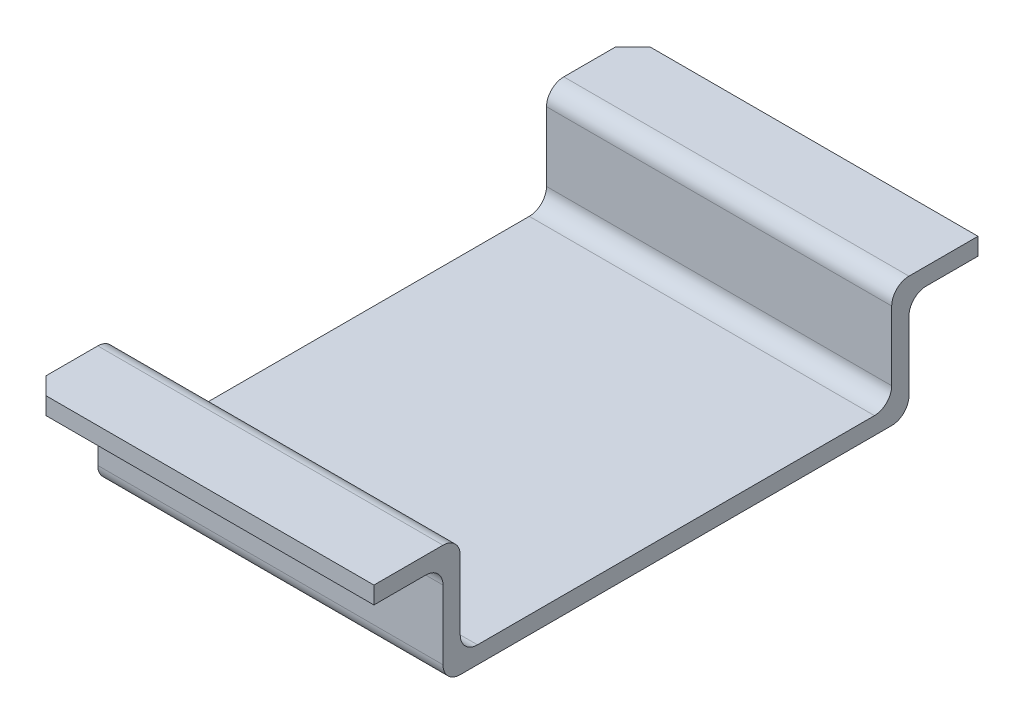
ISO-10303-21;
HEADER;
FILE_DESCRIPTION(('STEP AP214'),'2;1');
FILE_NAME('part.step','',(''),(''),'','','');
FILE_SCHEMA(('AUTOMOTIVE_DESIGN { 1 0 10303 214 1 1 1 1 }'));
ENDSEC;
DATA;
#1=APPLICATION_CONTEXT('core data for automotive mechanical design processes');
#2=APPLICATION_PROTOCOL_DEFINITION('international standard','automotive_design',2000,#1);
#3=PRODUCT_CONTEXT('',#1,'mechanical');
#4=PRODUCT('Part','Part','',(#3));
#5=PRODUCT_RELATED_PRODUCT_CATEGORY('part','',(#4));
#6=PRODUCT_DEFINITION_FORMATION('','',#4);
#7=PRODUCT_DEFINITION_CONTEXT('part definition',#1,'design');
#8=PRODUCT_DEFINITION('design','',#6,#7);
#9=PRODUCT_DEFINITION_SHAPE('','',#8);
#10=(LENGTH_UNIT() NAMED_UNIT(*) SI_UNIT(.MILLI.,.METRE.));
#11=(NAMED_UNIT(*) PLANE_ANGLE_UNIT() SI_UNIT($,.RADIAN.));
#12=(NAMED_UNIT(*) SI_UNIT($,.STERADIAN.) SOLID_ANGLE_UNIT());
#13=UNCERTAINTY_MEASURE_WITH_UNIT(LENGTH_MEASURE(1.E-05),#10,'distance_accuracy_value','');
#14=(GEOMETRIC_REPRESENTATION_CONTEXT(3) GLOBAL_UNCERTAINTY_ASSIGNED_CONTEXT((#13)) GLOBAL_UNIT_ASSIGNED_CONTEXT((#10,
#11,#12)) REPRESENTATION_CONTEXT('',''));
#15=CARTESIAN_POINT('',(0.,0.,0.));
#16=DIRECTION('',(0.,0.,1.));
#17=DIRECTION('',(1.,0.,0.));
#18=AXIS2_PLACEMENT_3D('',#15,#16,#17);
#19=CARTESIAN_POINT('',(20.,-1.,-13.5));
#20=DIRECTION('',(0.,0.,1.));
#21=DIRECTION('',(1.,0.,0.));
#22=AXIS2_PLACEMENT_3D('',#19,#20,#21);
#23=PLANE('',#22);
#24=DIRECTION('',(0.,1.,0.));
#25=VECTOR('',#24,1.);
#26=CARTESIAN_POINT('',(20.,-1.,-13.5));
#27=LINE('',#26,#25);
#28=CARTESIAN_POINT('',(20.,0.,-13.5));
#29=VERTEX_POINT('',#28);
#30=CARTESIAN_POINT('',(20.,4.,-13.5));
#31=VERTEX_POINT('',#30);
#32=EDGE_CURVE('E194',#29,#31,#27,.T.);
#33=ORIENTED_EDGE('',*,*,#32,.F.);
#34=DIRECTION('',(-1.,0.,0.));
#35=VECTOR('',#34,1.);
#36=CARTESIAN_POINT('',(20.,0.,-13.5));
#37=LINE('',#36,#35);
#38=CARTESIAN_POINT('',(0.,0.,-13.5));
#39=VERTEX_POINT('',#38);
#40=EDGE_CURVE('E308',#29,#39,#37,.T.);
#41=ORIENTED_EDGE('',*,*,#40,.T.);
#42=DIRECTION('',(0.,1.,0.));
#43=VECTOR('',#42,1.);
#44=CARTESIAN_POINT('',(0.,-1.,-13.5));
#45=LINE('',#44,#43);
#46=CARTESIAN_POINT('',(0.,4.,-13.5));
#47=VERTEX_POINT('',#46);
#48=EDGE_CURVE('E232',#39,#47,#45,.T.);
#49=ORIENTED_EDGE('',*,*,#48,.T.);
#50=DIRECTION('',(-1.,0.,0.));
#51=VECTOR('',#50,1.);
#52=CARTESIAN_POINT('',(20.,4.,-13.5));
#53=LINE('',#52,#51);
#54=EDGE_CURVE('E306',#47,#31,#53,.F.);
#55=ORIENTED_EDGE('',*,*,#54,.T.);
#56=EDGE_LOOP('',(#33,#41,#49,#55));
#57=FACE_BOUND('',#56,.T.);
#58=ADVANCED_FACE('F34',(#57),#23,.F.);
#59=CARTESIAN_POINT('',(20.,5.,-13.5));
#60=DIRECTION('',(0.,1.,0.));
#61=DIRECTION('',(0.,0.,1.));
#62=AXIS2_PLACEMENT_3D('',#59,#60,#61);
#63=PLANE('',#62);
#64=DIRECTION('',(0.,0.,-1.));
#65=VECTOR('',#64,1.);
#66=CARTESIAN_POINT('',(0.,5.,-13.5));
#67=LINE('',#66,#65);
#68=CARTESIAN_POINT('',(0.,5.,-14.5));
#69=VERTEX_POINT('',#68);
#70=CARTESIAN_POINT('',(0.,5.,-16.5));
#71=VERTEX_POINT('',#70);
#72=EDGE_CURVE('E235',#69,#71,#67,.T.);
#73=ORIENTED_EDGE('',*,*,#72,.T.);
#74=DIRECTION('',(0.707106781186546,0.,-0.707106781186549));
#75=VECTOR('',#74,1.);
#76=CARTESIAN_POINT('',(1.,5.,-17.5));
#77=LINE('',#76,#75);
#78=CARTESIAN_POINT('',(1.,5.,-17.5));
#79=VERTEX_POINT('',#78);
#80=EDGE_CURVE('E11',#71,#79,#77,.T.);
#81=ORIENTED_EDGE('',*,*,#80,.T.);
#82=DIRECTION('',(-1.,0.,0.));
#83=VECTOR('',#82,1.);
#84=CARTESIAN_POINT('',(20.,5.,-17.5));
#85=LINE('',#84,#83);
#86=CARTESIAN_POINT('',(20.,5.,-17.5));
#87=VERTEX_POINT('',#86);
#88=EDGE_CURVE('E196',#87,#79,#85,.T.);
#89=ORIENTED_EDGE('',*,*,#88,.F.);
#90=DIRECTION('',(0.,0.,-1.));
#91=VECTOR('',#90,1.);
#92=CARTESIAN_POINT('',(20.,5.,-13.5));
#93=LINE('',#92,#91);
#94=CARTESIAN_POINT('',(20.,5.,-14.5));
#95=VERTEX_POINT('',#94);
#96=EDGE_CURVE('E182',#95,#87,#93,.T.);
#97=ORIENTED_EDGE('',*,*,#96,.F.);
#98=DIRECTION('',(-1.,0.,0.));
#99=VECTOR('',#98,1.);
#100=CARTESIAN_POINT('',(0.,5.,-14.5));
#101=LINE('',#100,#99);
#102=EDGE_CURVE('E311',#95,#69,#101,.T.);
#103=ORIENTED_EDGE('',*,*,#102,.T.);
#104=EDGE_LOOP('',(#73,#81,#89,#97,#103));
#105=FACE_BOUND('',#104,.T.);
#106=ADVANCED_FACE('F197',(#105),#63,.F.);
#107=CARTESIAN_POINT('',(20.,6.,-17.5));
#108=DIRECTION('',(0.,0.,1.));
#109=DIRECTION('',(1.,0.,0.));
#110=AXIS2_PLACEMENT_3D('',#107,#108,#109);
#111=PLANE('',#110);
#112=ORIENTED_EDGE('',*,*,#88,.T.);
#113=DIRECTION('',(0.,1.,0.));
#114=VECTOR('',#113,1.);
#115=CARTESIAN_POINT('',(1.,6.,-17.5));
#116=LINE('',#115,#114);
#117=CARTESIAN_POINT('',(1.,6.,-17.5));
#118=VERTEX_POINT('',#117);
#119=EDGE_CURVE('E347',#79,#118,#116,.T.);
#120=ORIENTED_EDGE('',*,*,#119,.T.);
#121=DIRECTION('',(-1.,0.,0.));
#122=VECTOR('',#121,1.);
#123=CARTESIAN_POINT('',(20.,6.,-17.5));
#124=LINE('',#123,#122);
#125=CARTESIAN_POINT('',(20.,6.,-17.5));
#126=VERTEX_POINT('',#125);
#127=EDGE_CURVE('E200',#126,#118,#124,.T.);
#128=ORIENTED_EDGE('',*,*,#127,.F.);
#129=DIRECTION('',(0.,1.,0.));
#130=VECTOR('',#129,1.);
#131=CARTESIAN_POINT('',(20.,6.,-17.5));
#132=LINE('',#131,#130);
#133=EDGE_CURVE('E187',#87,#126,#132,.T.);
#134=ORIENTED_EDGE('',*,*,#133,.F.);
#135=EDGE_LOOP('',(#112,#120,#128,#134));
#136=FACE_BOUND('',#135,.T.);
#137=ADVANCED_FACE('F202',(#136),#111,.F.);
#138=CARTESIAN_POINT('',(20.,6.,-12.5));
#139=DIRECTION('',(0.,-1.,0.));
#140=DIRECTION('',(0.,0.,-1.));
#141=AXIS2_PLACEMENT_3D('',#138,#139,#140);
#142=PLANE('',#141);
#143=ORIENTED_EDGE('',*,*,#127,.T.);
#144=DIRECTION('',(-0.707106781186546,0.,0.707106781186549));
#145=VECTOR('',#144,1.);
#146=CARTESIAN_POINT('',(1.,6.,-17.5));
#147=LINE('',#146,#145);
#148=CARTESIAN_POINT('',(0.,6.,-16.5));
#149=VERTEX_POINT('',#148);
#150=EDGE_CURVE('E42',#118,#149,#147,.T.);
#151=ORIENTED_EDGE('',*,*,#150,.T.);
#152=DIRECTION('',(0.,0.,1.));
#153=VECTOR('',#152,1.);
#154=CARTESIAN_POINT('',(0.,6.,-12.5));
#155=LINE('',#154,#153);
#156=CARTESIAN_POINT('',(0.,6.,-13.5));
#157=VERTEX_POINT('',#156);
#158=EDGE_CURVE('E237',#149,#157,#155,.T.);
#159=ORIENTED_EDGE('',*,*,#158,.T.);
#160=DIRECTION('',(-1.,0.,0.));
#161=VECTOR('',#160,1.);
#162=CARTESIAN_POINT('',(20.,6.,-13.5));
#163=LINE('',#162,#161);
#164=CARTESIAN_POINT('',(20.,6.,-13.5));
#165=VERTEX_POINT('',#164);
#166=EDGE_CURVE('E318',#157,#165,#163,.F.);
#167=ORIENTED_EDGE('',*,*,#166,.T.);
#168=DIRECTION('',(0.,0.,1.));
#169=VECTOR('',#168,1.);
#170=CARTESIAN_POINT('',(20.,6.,-12.5));
#171=LINE('',#170,#169);
#172=EDGE_CURVE('E205',#126,#165,#171,.T.);
#173=ORIENTED_EDGE('',*,*,#172,.F.);
#174=EDGE_LOOP('',(#143,#151,#159,#167,#173));
#175=FACE_BOUND('',#174,.T.);
#176=ADVANCED_FACE('F350',(#175),#142,.F.);
#177=CARTESIAN_POINT('',(20.,0.,-12.5));
#178=DIRECTION('',(0.,0.,-1.));
#179=DIRECTION('',(-1.,0.,0.));
#180=AXIS2_PLACEMENT_3D('',#177,#178,#179);
#181=PLANE('',#180);
#182=DIRECTION('',(0.,-1.,0.));
#183=VECTOR('',#182,1.);
#184=CARTESIAN_POINT('',(20.,0.,-12.5));
#185=LINE('',#184,#183);
#186=CARTESIAN_POINT('',(20.,5.,-12.5));
#187=VERTEX_POINT('',#186);
#188=CARTESIAN_POINT('',(20.,1.,-12.5));
#189=VERTEX_POINT('',#188);
#190=EDGE_CURVE('E207',#187,#189,#185,.T.);
#191=ORIENTED_EDGE('',*,*,#190,.F.);
#192=DIRECTION('',(-1.,0.,0.));
#193=VECTOR('',#192,1.);
#194=CARTESIAN_POINT('',(20.,5.,-12.5));
#195=LINE('',#194,#193);
#196=CARTESIAN_POINT('',(0.,5.,-12.5));
#197=VERTEX_POINT('',#196);
#198=EDGE_CURVE('E315',#187,#197,#195,.T.);
#199=ORIENTED_EDGE('',*,*,#198,.T.);
#200=DIRECTION('',(0.,-1.,0.));
#201=VECTOR('',#200,1.);
#202=CARTESIAN_POINT('',(0.,0.,-12.5));
#203=LINE('',#202,#201);
#204=CARTESIAN_POINT('',(0.,1.,-12.5));
#205=VERTEX_POINT('',#204);
#206=EDGE_CURVE('E239',#197,#205,#203,.T.);
#207=ORIENTED_EDGE('',*,*,#206,.T.);
#208=DIRECTION('',(-1.,0.,0.));
#209=VECTOR('',#208,1.);
#210=CARTESIAN_POINT('',(20.,1.,-12.5));
#211=LINE('',#210,#209);
#212=EDGE_CURVE('E313',#205,#189,#211,.F.);
#213=ORIENTED_EDGE('',*,*,#212,.T.);
#214=EDGE_LOOP('',(#191,#199,#207,#213));
#215=FACE_BOUND('',#214,.T.);
#216=ADVANCED_FACE('F477',(#215),#181,.F.);
#217=CARTESIAN_POINT('',(20.,0.,0.));
#218=DIRECTION('',(0.,-1.,0.));
#219=DIRECTION('',(0.,0.,-1.));
#220=AXIS2_PLACEMENT_3D('',#217,#218,#219);
#221=PLANE('',#220);
#222=DIRECTION('',(0.,0.,1.));
#223=VECTOR('',#222,1.);
#224=CARTESIAN_POINT('',(0.,0.,0.));
#225=LINE('',#224,#223);
#226=CARTESIAN_POINT('',(0.,0.,-11.5));
#227=VERTEX_POINT('',#226);
#228=CARTESIAN_POINT('',(0.,0.,11.5));
#229=VERTEX_POINT('',#228);
#230=EDGE_CURVE('E242',#227,#229,#225,.T.);
#231=ORIENTED_EDGE('',*,*,#230,.T.);
#232=DIRECTION('',(-1.,0.,0.));
#233=VECTOR('',#232,1.);
#234=CARTESIAN_POINT('',(20.,0.,11.5));
#235=LINE('',#234,#233);
#236=CARTESIAN_POINT('',(20.,0.,11.5));
#237=VERTEX_POINT('',#236);
#238=EDGE_CURVE('E292',#229,#237,#235,.F.);
#239=ORIENTED_EDGE('',*,*,#238,.T.);
#240=DIRECTION('',(0.,0.,1.));
#241=VECTOR('',#240,1.);
#242=CARTESIAN_POINT('',(20.,0.,0.));
#243=LINE('',#242,#241);
#244=CARTESIAN_POINT('',(20.,0.,-11.5));
#245=VERTEX_POINT('',#244);
#246=EDGE_CURVE('E213',#245,#237,#243,.T.);
#247=ORIENTED_EDGE('',*,*,#246,.F.);
#248=DIRECTION('',(-1.,0.,0.));
#249=VECTOR('',#248,1.);
#250=CARTESIAN_POINT('',(0.,0.,-11.5));
#251=LINE('',#250,#249);
#252=EDGE_CURVE('E289',#245,#227,#251,.T.);
#253=ORIENTED_EDGE('',*,*,#252,.T.);
#254=EDGE_LOOP('',(#231,#239,#247,#253));
#255=FACE_BOUND('',#254,.T.);
#256=ADVANCED_FACE('F413',(#255),#221,.F.);
#257=CARTESIAN_POINT('',(20.,0.,12.5));
#258=DIRECTION('',(0.,0.,1.));
#259=DIRECTION('',(1.,0.,0.));
#260=AXIS2_PLACEMENT_3D('',#257,#258,#259);
#261=PLANE('',#260);
#262=DIRECTION('',(0.,1.,0.));
#263=VECTOR('',#262,1.);
#264=CARTESIAN_POINT('',(0.,0.,12.5));
#265=LINE('',#264,#263);
#266=CARTESIAN_POINT('',(0.,0.999999999999999,12.5));
#267=VERTEX_POINT('',#266);
#268=CARTESIAN_POINT('',(0.,5.,12.5));
#269=VERTEX_POINT('',#268);
#270=EDGE_CURVE('E245',#267,#269,#265,.T.);
#271=ORIENTED_EDGE('',*,*,#270,.T.);
#272=DIRECTION('',(-1.,0.,0.));
#273=VECTOR('',#272,1.);
#274=CARTESIAN_POINT('',(20.,5.,12.5));
#275=LINE('',#274,#273);
#276=CARTESIAN_POINT('',(20.,5.,12.5));
#277=VERTEX_POINT('',#276);
#278=EDGE_CURVE('E279',#269,#277,#275,.F.);
#279=ORIENTED_EDGE('',*,*,#278,.T.);
#280=DIRECTION('',(0.,1.,0.));
#281=VECTOR('',#280,1.);
#282=CARTESIAN_POINT('',(20.,0.,12.5));
#283=LINE('',#282,#281);
#284=CARTESIAN_POINT('',(20.,0.999999999999999,12.5));
#285=VERTEX_POINT('',#284);
#286=EDGE_CURVE('E216',#285,#277,#283,.T.);
#287=ORIENTED_EDGE('',*,*,#286,.F.);
#288=DIRECTION('',(-1.,0.,0.));
#289=VECTOR('',#288,1.);
#290=CARTESIAN_POINT('',(0.,0.999999999999999,12.5));
#291=LINE('',#290,#289);
#292=EDGE_CURVE('E276',#285,#267,#291,.T.);
#293=ORIENTED_EDGE('',*,*,#292,.T.);
#294=EDGE_LOOP('',(#271,#279,#287,#293));
#295=FACE_BOUND('',#294,.T.);
#296=ADVANCED_FACE('F420',(#295),#261,.F.);
#297=CARTESIAN_POINT('',(20.,6.,12.5));
#298=DIRECTION('',(0.,-1.,0.));
#299=DIRECTION('',(0.,0.,-1.));
#300=AXIS2_PLACEMENT_3D('',#297,#298,#299);
#301=PLANE('',#300);
#302=DIRECTION('',(0.,0.,1.));
#303=VECTOR('',#302,1.);
#304=CARTESIAN_POINT('',(0.,6.,12.5));
#305=LINE('',#304,#303);
#306=CARTESIAN_POINT('',(0.,6.,13.5));
#307=VERTEX_POINT('',#306);
#308=CARTESIAN_POINT('',(0.,6.,16.5));
#309=VERTEX_POINT('',#308);
#310=EDGE_CURVE('E248',#307,#309,#305,.T.);
#311=ORIENTED_EDGE('',*,*,#310,.T.);
#312=DIRECTION('',(0.707106781186546,0.,0.707106781186549));
#313=VECTOR('',#312,1.);
#314=CARTESIAN_POINT('',(1.,6.,17.5));
#315=LINE('',#314,#313);
#316=CARTESIAN_POINT('',(1.,6.,17.5));
#317=VERTEX_POINT('',#316);
#318=EDGE_CURVE('E345',#309,#317,#315,.T.);
#319=ORIENTED_EDGE('',*,*,#318,.T.);
#320=DIRECTION('',(-1.,0.,0.));
#321=VECTOR('',#320,1.);
#322=CARTESIAN_POINT('',(20.,6.,17.5));
#323=LINE('',#322,#321);
#324=CARTESIAN_POINT('',(20.,6.,17.5));
#325=VERTEX_POINT('',#324);
#326=EDGE_CURVE('E261',#325,#317,#323,.T.);
#327=ORIENTED_EDGE('',*,*,#326,.F.);
#328=DIRECTION('',(0.,0.,1.));
#329=VECTOR('',#328,1.);
#330=CARTESIAN_POINT('',(20.,6.,12.5));
#331=LINE('',#330,#329);
#332=CARTESIAN_POINT('',(20.,6.,13.5));
#333=VERTEX_POINT('',#332);
#334=EDGE_CURVE('E218',#333,#325,#331,.T.);
#335=ORIENTED_EDGE('',*,*,#334,.F.);
#336=DIRECTION('',(-1.,0.,0.));
#337=VECTOR('',#336,1.);
#338=CARTESIAN_POINT('',(20.,6.,13.5));
#339=LINE('',#338,#337);
#340=EDGE_CURVE('E199',#333,#307,#339,.T.);
#341=ORIENTED_EDGE('',*,*,#340,.T.);
#342=EDGE_LOOP('',(#311,#319,#327,#335,#341));
#343=FACE_BOUND('',#342,.T.);
#344=ADVANCED_FACE('F427',(#343),#301,.F.);
#345=CARTESIAN_POINT('',(20.,6.,17.5));
#346=DIRECTION('',(0.,0.,-1.));
#347=DIRECTION('',(-1.,0.,0.));
#348=AXIS2_PLACEMENT_3D('',#345,#346,#347);
#349=PLANE('',#348);
#350=ORIENTED_EDGE('',*,*,#326,.T.);
#351=DIRECTION('',(0.,-1.,0.));
#352=VECTOR('',#351,1.);
#353=CARTESIAN_POINT('',(1.,5.,17.5));
#354=LINE('',#353,#352);
#355=CARTESIAN_POINT('',(1.,5.,17.5));
#356=VERTEX_POINT('',#355);
#357=EDGE_CURVE('E336',#317,#356,#354,.T.);
#358=ORIENTED_EDGE('',*,*,#357,.T.);
#359=DIRECTION('',(-1.,0.,0.));
#360=VECTOR('',#359,1.);
#361=CARTESIAN_POINT('',(20.,5.,17.5));
#362=LINE('',#361,#360);
#363=CARTESIAN_POINT('',(20.,5.,17.5));
#364=VERTEX_POINT('',#363);
#365=EDGE_CURVE('E231',#364,#356,#362,.T.);
#366=ORIENTED_EDGE('',*,*,#365,.F.);
#367=DIRECTION('',(0.,-1.,0.));
#368=VECTOR('',#367,1.);
#369=CARTESIAN_POINT('',(20.,6.,17.5));
#370=LINE('',#369,#368);
#371=EDGE_CURVE('E220',#325,#364,#370,.T.);
#372=ORIENTED_EDGE('',*,*,#371,.F.);
#373=EDGE_LOOP('',(#350,#358,#366,#372));
#374=FACE_BOUND('',#373,.T.);
#375=ADVANCED_FACE('F434',(#374),#349,.F.);
#376=CARTESIAN_POINT('',(20.,5.,13.5));
#377=DIRECTION('',(0.,1.,0.));
#378=DIRECTION('',(0.,0.,1.));
#379=AXIS2_PLACEMENT_3D('',#376,#377,#378);
#380=PLANE('',#379);
#381=ORIENTED_EDGE('',*,*,#365,.T.);
#382=DIRECTION('',(-0.707106781186546,0.,-0.707106781186549));
#383=VECTOR('',#382,1.);
#384=CARTESIAN_POINT('',(1.,5.,17.5));
#385=LINE('',#384,#383);
#386=CARTESIAN_POINT('',(0.,5.,16.5));
#387=VERTEX_POINT('',#386);
#388=EDGE_CURVE('E339',#356,#387,#385,.T.);
#389=ORIENTED_EDGE('',*,*,#388,.T.);
#390=DIRECTION('',(0.,0.,-1.));
#391=VECTOR('',#390,1.);
#392=CARTESIAN_POINT('',(0.,5.,13.5));
#393=LINE('',#392,#391);
#394=CARTESIAN_POINT('',(0.,5.,14.5));
#395=VERTEX_POINT('',#394);
#396=EDGE_CURVE('E251',#387,#395,#393,.T.);
#397=ORIENTED_EDGE('',*,*,#396,.T.);
#398=DIRECTION('',(-1.,0.,0.));
#399=VECTOR('',#398,1.);
#400=CARTESIAN_POINT('',(20.,5.,14.5));
#401=LINE('',#400,#399);
#402=CARTESIAN_POINT('',(20.,5.,14.5));
#403=VERTEX_POINT('',#402);
#404=EDGE_CURVE('E299',#395,#403,#401,.F.);
#405=ORIENTED_EDGE('',*,*,#404,.T.);
#406=DIRECTION('',(0.,0.,-1.));
#407=VECTOR('',#406,1.);
#408=CARTESIAN_POINT('',(20.,5.,13.5));
#409=LINE('',#408,#407);
#410=EDGE_CURVE('E222',#364,#403,#409,.T.);
#411=ORIENTED_EDGE('',*,*,#410,.F.);
#412=EDGE_LOOP('',(#381,#389,#397,#405,#411));
#413=FACE_BOUND('',#412,.T.);
#414=ADVANCED_FACE('F463',(#413),#380,.F.);
#415=CARTESIAN_POINT('',(20.,-1.,13.5));
#416=DIRECTION('',(0.,0.,-1.));
#417=DIRECTION('',(-1.,0.,0.));
#418=AXIS2_PLACEMENT_3D('',#415,#416,#417);
#419=PLANE('',#418);
#420=DIRECTION('',(0.,-1.,0.));
#421=VECTOR('',#420,1.);
#422=CARTESIAN_POINT('',(20.,-1.,13.5));
#423=LINE('',#422,#421);
#424=CARTESIAN_POINT('',(20.,4.,13.5));
#425=VERTEX_POINT('',#424);
#426=CARTESIAN_POINT('',(20.,0.,13.5));
#427=VERTEX_POINT('',#426);
#428=EDGE_CURVE('E225',#425,#427,#423,.T.);
#429=ORIENTED_EDGE('',*,*,#428,.F.);
#430=DIRECTION('',(-1.,0.,0.));
#431=VECTOR('',#430,1.);
#432=CARTESIAN_POINT('',(0.,4.,13.5));
#433=LINE('',#432,#431);
#434=CARTESIAN_POINT('',(0.,4.,13.5));
#435=VERTEX_POINT('',#434);
#436=EDGE_CURVE('E296',#425,#435,#433,.T.);
#437=ORIENTED_EDGE('',*,*,#436,.T.);
#438=DIRECTION('',(0.,-1.,0.));
#439=VECTOR('',#438,1.);
#440=CARTESIAN_POINT('',(0.,-1.,13.5));
#441=LINE('',#440,#439);
#442=CARTESIAN_POINT('',(0.,0.,13.5));
#443=VERTEX_POINT('',#442);
#444=EDGE_CURVE('E253',#435,#443,#441,.T.);
#445=ORIENTED_EDGE('',*,*,#444,.T.);
#446=DIRECTION('',(-1.,0.,0.));
#447=VECTOR('',#446,1.);
#448=CARTESIAN_POINT('',(20.,0.,13.5));
#449=LINE('',#448,#447);
#450=EDGE_CURVE('E294',#443,#427,#449,.F.);
#451=ORIENTED_EDGE('',*,*,#450,.T.);
#452=EDGE_LOOP('',(#429,#437,#445,#451));
#453=FACE_BOUND('',#452,.T.);
#454=ADVANCED_FACE('F443',(#453),#419,.F.);
#455=CARTESIAN_POINT('',(20.,-1.,0.));
#456=DIRECTION('',(0.,1.,0.));
#457=DIRECTION('',(0.,0.,1.));
#458=AXIS2_PLACEMENT_3D('',#455,#456,#457);
#459=PLANE('',#458);
#460=DIRECTION('',(0.,0.,-1.));
#461=VECTOR('',#460,1.);
#462=CARTESIAN_POINT('',(20.,-1.,0.));
#463=LINE('',#462,#461);
#464=CARTESIAN_POINT('',(20.,-1.,12.5));
#465=VERTEX_POINT('',#464);
#466=CARTESIAN_POINT('',(20.,-0.999999999999999,-12.5));
#467=VERTEX_POINT('',#466);
#468=EDGE_CURVE('E228',#465,#467,#463,.T.);
#469=ORIENTED_EDGE('',*,*,#468,.F.);
#470=DIRECTION('',(-1.,0.,0.));
#471=VECTOR('',#470,1.);
#472=CARTESIAN_POINT('',(20.,-0.999999999999999,12.5));
#473=LINE('',#472,#471);
#474=CARTESIAN_POINT('',(0.,-0.999999999999999,12.5));
#475=VERTEX_POINT('',#474);
#476=EDGE_CURVE('E303',#465,#475,#473,.T.);
#477=ORIENTED_EDGE('',*,*,#476,.T.);
#478=DIRECTION('',(0.,0.,-1.));
#479=VECTOR('',#478,1.);
#480=CARTESIAN_POINT('',(0.,-1.,0.));
#481=LINE('',#480,#479);
#482=CARTESIAN_POINT('',(0.,-1.,-12.5));
#483=VERTEX_POINT('',#482);
#484=EDGE_CURVE('E256',#475,#483,#481,.T.);
#485=ORIENTED_EDGE('',*,*,#484,.T.);
#486=DIRECTION('',(-1.,0.,0.));
#487=VECTOR('',#486,1.);
#488=CARTESIAN_POINT('',(20.,-1.,-12.5));
#489=LINE('',#488,#487);
#490=EDGE_CURVE('E301',#483,#467,#489,.F.);
#491=ORIENTED_EDGE('',*,*,#490,.T.);
#492=EDGE_LOOP('',(#469,#477,#485,#491));
#493=FACE_BOUND('',#492,.T.);
#494=ADVANCED_FACE('F450',(#493),#459,.F.);
#495=CARTESIAN_POINT('',(20.,0.,0.));
#496=DIRECTION('',(-1.,0.,0.));
#497=DIRECTION('',(0.,0.,1.));
#498=AXIS2_PLACEMENT_3D('',#495,#496,#497);
#499=PLANE('',#498);
#500=ORIENTED_EDGE('',*,*,#286,.T.);
#501=CARTESIAN_POINT('',(20.,5.,13.5));
#502=DIRECTION('',(-1.,0.,0.));
#503=DIRECTION('',(0.,0.,1.));
#504=AXIS2_PLACEMENT_3D('',#501,#502,#503);
#505=CIRCLE('',#504,1.);
#506=EDGE_CURVE('E287',#277,#333,#505,.F.);
#507=ORIENTED_EDGE('',*,*,#506,.T.);
#508=ORIENTED_EDGE('',*,*,#334,.T.);
#509=ORIENTED_EDGE('',*,*,#371,.T.);
#510=ORIENTED_EDGE('',*,*,#410,.T.);
#511=CARTESIAN_POINT('',(20.,4.,14.5));
#512=DIRECTION('',(-1.,0.,0.));
#513=DIRECTION('',(0.,0.,1.));
#514=AXIS2_PLACEMENT_3D('',#511,#512,#513);
#515=CIRCLE('',#514,1.);
#516=EDGE_CURVE('E327',#403,#425,#515,.T.);
#517=ORIENTED_EDGE('',*,*,#516,.T.);
#518=ORIENTED_EDGE('',*,*,#428,.T.);
#519=CARTESIAN_POINT('',(20.,0.,12.5));
#520=DIRECTION('',(-1.,0.,0.));
#521=DIRECTION('',(0.,0.,1.));
#522=AXIS2_PLACEMENT_3D('',#519,#520,#521);
#523=CIRCLE('',#522,1.);
#524=EDGE_CURVE('E285',#427,#465,#523,.F.);
#525=ORIENTED_EDGE('',*,*,#524,.T.);
#526=ORIENTED_EDGE('',*,*,#468,.T.);
#527=CARTESIAN_POINT('',(20.,0.,-12.5));
#528=DIRECTION('',(-1.,0.,0.));
#529=DIRECTION('',(0.,0.,1.));
#530=AXIS2_PLACEMENT_3D('',#527,#528,#529);
#531=CIRCLE('',#530,1.);
#532=EDGE_CURVE('E283',#467,#29,#531,.F.);
#533=ORIENTED_EDGE('',*,*,#532,.T.);
#534=ORIENTED_EDGE('',*,*,#32,.T.);
#535=CARTESIAN_POINT('',(20.,4.,-14.5));
#536=DIRECTION('',(-1.,0.,0.));
#537=DIRECTION('',(0.,0.,1.));
#538=AXIS2_PLACEMENT_3D('',#535,#536,#537);
#539=CIRCLE('',#538,1.);
#540=EDGE_CURVE('E191',#31,#95,#539,.T.);
#541=ORIENTED_EDGE('',*,*,#540,.T.);
#542=ORIENTED_EDGE('',*,*,#96,.T.);
#543=ORIENTED_EDGE('',*,*,#133,.T.);
#544=ORIENTED_EDGE('',*,*,#172,.T.);
#545=CARTESIAN_POINT('',(20.,5.,-13.5));
#546=DIRECTION('',(-1.,0.,0.));
#547=DIRECTION('',(0.,0.,1.));
#548=AXIS2_PLACEMENT_3D('',#545,#546,#547);
#549=CIRCLE('',#548,1.);
#550=EDGE_CURVE('E281',#165,#187,#549,.F.);
#551=ORIENTED_EDGE('',*,*,#550,.T.);
#552=ORIENTED_EDGE('',*,*,#190,.T.);
#553=CARTESIAN_POINT('',(20.,1.,-11.5));
#554=DIRECTION('',(-1.,0.,0.));
#555=DIRECTION('',(0.,0.,1.));
#556=AXIS2_PLACEMENT_3D('',#553,#554,#555);
#557=CIRCLE('',#556,1.);
#558=EDGE_CURVE('E334',#189,#245,#557,.T.);
#559=ORIENTED_EDGE('',*,*,#558,.T.);
#560=ORIENTED_EDGE('',*,*,#246,.T.);
#561=CARTESIAN_POINT('',(20.,0.999999999999999,11.5));
#562=DIRECTION('',(-1.,0.,0.));
#563=DIRECTION('',(0.,0.,1.));
#564=AXIS2_PLACEMENT_3D('',#561,#562,#563);
#565=CIRCLE('',#564,1.);
#566=EDGE_CURVE('E322',#237,#285,#565,.T.);
#567=ORIENTED_EDGE('',*,*,#566,.T.);
#568=EDGE_LOOP('',(#500,#507,#508,#509,#510,#517,#518,#525,#526,#533,#534,#541,#542,#543,#544,
#551,#552,#559,#560,#567));
#569=FACE_BOUND('',#568,.T.);
#570=ADVANCED_FACE('F184',(#569),#499,.F.);
#571=CARTESIAN_POINT('',(0.,0.,0.));
#572=DIRECTION('',(-1.,0.,0.));
#573=DIRECTION('',(0.,0.,1.));
#574=AXIS2_PLACEMENT_3D('',#571,#572,#573);
#575=PLANE('',#574);
#576=ORIENTED_EDGE('',*,*,#396,.F.);
#577=DIRECTION('',(0.,1.,0.));
#578=VECTOR('',#577,1.);
#579=CARTESIAN_POINT('',(0.,6.,16.5));
#580=LINE('',#579,#578);
#581=EDGE_CURVE('E343',#387,#309,#580,.T.);
#582=ORIENTED_EDGE('',*,*,#581,.T.);
#583=ORIENTED_EDGE('',*,*,#310,.F.);
#584=CARTESIAN_POINT('',(0.,5.,13.5));
#585=DIRECTION('',(-1.,0.,0.));
#586=DIRECTION('',(0.,0.,1.));
#587=AXIS2_PLACEMENT_3D('',#584,#585,#586);
#588=CIRCLE('',#587,1.);
#589=EDGE_CURVE('E274',#307,#269,#588,.T.);
#590=ORIENTED_EDGE('',*,*,#589,.T.);
#591=ORIENTED_EDGE('',*,*,#270,.F.);
#592=CARTESIAN_POINT('',(0.,0.999999999999999,11.5));
#593=DIRECTION('',(-1.,0.,0.));
#594=DIRECTION('',(0.,0.,1.));
#595=AXIS2_PLACEMENT_3D('',#592,#593,#594);
#596=CIRCLE('',#595,1.);
#597=EDGE_CURVE('E320',#267,#229,#596,.F.);
#598=ORIENTED_EDGE('',*,*,#597,.T.);
#599=ORIENTED_EDGE('',*,*,#230,.F.);
#600=CARTESIAN_POINT('',(0.,1.,-11.5));
#601=DIRECTION('',(-1.,0.,0.));
#602=DIRECTION('',(0.,0.,1.));
#603=AXIS2_PLACEMENT_3D('',#600,#601,#602);
#604=CIRCLE('',#603,1.);
#605=EDGE_CURVE('E332',#227,#205,#604,.F.);
#606=ORIENTED_EDGE('',*,*,#605,.T.);
#607=ORIENTED_EDGE('',*,*,#206,.F.);
#608=CARTESIAN_POINT('',(0.,5.,-13.5));
#609=DIRECTION('',(-1.,0.,0.));
#610=DIRECTION('',(0.,0.,1.));
#611=AXIS2_PLACEMENT_3D('',#608,#609,#610);
#612=CIRCLE('',#611,1.);
#613=EDGE_CURVE('E267',#197,#157,#612,.T.);
#614=ORIENTED_EDGE('',*,*,#613,.T.);
#615=ORIENTED_EDGE('',*,*,#158,.F.);
#616=DIRECTION('',(0.,-1.,0.));
#617=VECTOR('',#616,1.);
#618=CARTESIAN_POINT('',(0.,5.,-16.5));
#619=LINE('',#618,#617);
#620=EDGE_CURVE('E341',#149,#71,#619,.T.);
#621=ORIENTED_EDGE('',*,*,#620,.T.);
#622=ORIENTED_EDGE('',*,*,#72,.F.);
#623=CARTESIAN_POINT('',(0.,4.,-14.5));
#624=DIRECTION('',(-1.,0.,0.));
#625=DIRECTION('',(0.,0.,1.));
#626=AXIS2_PLACEMENT_3D('',#623,#624,#625);
#627=CIRCLE('',#626,1.);
#628=EDGE_CURVE('E329',#69,#47,#627,.F.);
#629=ORIENTED_EDGE('',*,*,#628,.T.);
#630=ORIENTED_EDGE('',*,*,#48,.F.);
#631=CARTESIAN_POINT('',(0.,0.,-12.5));
#632=DIRECTION('',(-1.,0.,0.));
#633=DIRECTION('',(0.,0.,1.));
#634=AXIS2_PLACEMENT_3D('',#631,#632,#633);
#635=CIRCLE('',#634,1.);
#636=EDGE_CURVE('E270',#39,#483,#635,.T.);
#637=ORIENTED_EDGE('',*,*,#636,.T.);
#638=ORIENTED_EDGE('',*,*,#484,.F.);
#639=CARTESIAN_POINT('',(0.,0.,12.5));
#640=DIRECTION('',(-1.,0.,0.));
#641=DIRECTION('',(0.,0.,1.));
#642=AXIS2_PLACEMENT_3D('',#639,#640,#641);
#643=CIRCLE('',#642,1.);
#644=EDGE_CURVE('E272',#475,#443,#643,.T.);
#645=ORIENTED_EDGE('',*,*,#644,.T.);
#646=ORIENTED_EDGE('',*,*,#444,.F.);
#647=CARTESIAN_POINT('',(0.,4.,14.5));
#648=DIRECTION('',(-1.,0.,0.));
#649=DIRECTION('',(0.,0.,1.));
#650=AXIS2_PLACEMENT_3D('',#647,#648,#649);
#651=CIRCLE('',#650,1.);
#652=EDGE_CURVE('E324',#435,#395,#651,.F.);
#653=ORIENTED_EDGE('',*,*,#652,.T.);
#654=EDGE_LOOP('',(#576,#582,#583,#590,#591,#598,#599,#606,#607,#614,#615,#621,#622,#629,#630,
#637,#638,#645,#646,#653));
#655=FACE_BOUND('',#654,.T.);
#656=ADVANCED_FACE('F353',(#655),#575,.T.);
#657=CARTESIAN_POINT('',(20.,5.,13.5));
#658=DIRECTION('',(-1.,0.,0.));
#659=DIRECTION('',(0.,0.,1.));
#660=AXIS2_PLACEMENT_3D('',#657,#658,#659);
#661=CYLINDRICAL_SURFACE('',#660,1.);
#662=ORIENTED_EDGE('',*,*,#506,.F.);
#663=ORIENTED_EDGE('',*,*,#278,.F.);
#664=ORIENTED_EDGE('',*,*,#589,.F.);
#665=ORIENTED_EDGE('',*,*,#340,.F.);
#666=EDGE_LOOP('',(#662,#663,#664,#665));
#667=FACE_BOUND('',#666,.T.);
#668=ADVANCED_FACE('F374',(#667),#661,.T.);
#669=CARTESIAN_POINT('',(20.,0.999999999999999,11.5));
#670=DIRECTION('',(1.,0.,0.));
#671=DIRECTION('',(0.,0.,-1.));
#672=AXIS2_PLACEMENT_3D('',#669,#670,#671);
#673=CYLINDRICAL_SURFACE('',#672,1.);
#674=ORIENTED_EDGE('',*,*,#566,.F.);
#675=ORIENTED_EDGE('',*,*,#238,.F.);
#676=ORIENTED_EDGE('',*,*,#597,.F.);
#677=ORIENTED_EDGE('',*,*,#292,.F.);
#678=EDGE_LOOP('',(#674,#675,#676,#677));
#679=FACE_BOUND('',#678,.T.);
#680=ADVANCED_FACE('F377',(#679),#673,.F.);
#681=CARTESIAN_POINT('',(20.,4.,14.5));
#682=DIRECTION('',(1.,0.,0.));
#683=DIRECTION('',(0.,0.,-1.));
#684=AXIS2_PLACEMENT_3D('',#681,#682,#683);
#685=CYLINDRICAL_SURFACE('',#684,1.);
#686=ORIENTED_EDGE('',*,*,#516,.F.);
#687=ORIENTED_EDGE('',*,*,#404,.F.);
#688=ORIENTED_EDGE('',*,*,#652,.F.);
#689=ORIENTED_EDGE('',*,*,#436,.F.);
#690=EDGE_LOOP('',(#686,#687,#688,#689));
#691=FACE_BOUND('',#690,.T.);
#692=ADVANCED_FACE('F381',(#691),#685,.F.);
#693=CARTESIAN_POINT('',(20.,0.,12.5));
#694=DIRECTION('',(-1.,0.,0.));
#695=DIRECTION('',(0.,0.,1.));
#696=AXIS2_PLACEMENT_3D('',#693,#694,#695);
#697=CYLINDRICAL_SURFACE('',#696,1.);
#698=ORIENTED_EDGE('',*,*,#524,.F.);
#699=ORIENTED_EDGE('',*,*,#450,.F.);
#700=ORIENTED_EDGE('',*,*,#644,.F.);
#701=ORIENTED_EDGE('',*,*,#476,.F.);
#702=EDGE_LOOP('',(#698,#699,#700,#701));
#703=FACE_BOUND('',#702,.T.);
#704=ADVANCED_FACE('F385',(#703),#697,.T.);
#705=CARTESIAN_POINT('',(20.,0.,-12.5));
#706=DIRECTION('',(-1.,0.,0.));
#707=DIRECTION('',(0.,0.,1.));
#708=AXIS2_PLACEMENT_3D('',#705,#706,#707);
#709=CYLINDRICAL_SURFACE('',#708,1.);
#710=ORIENTED_EDGE('',*,*,#532,.F.);
#711=ORIENTED_EDGE('',*,*,#490,.F.);
#712=ORIENTED_EDGE('',*,*,#636,.F.);
#713=ORIENTED_EDGE('',*,*,#40,.F.);
#714=EDGE_LOOP('',(#710,#711,#712,#713));
#715=FACE_BOUND('',#714,.T.);
#716=ADVANCED_FACE('F389',(#715),#709,.T.);
#717=CARTESIAN_POINT('',(20.,4.,-14.5));
#718=DIRECTION('',(1.,0.,0.));
#719=DIRECTION('',(0.,0.,-1.));
#720=AXIS2_PLACEMENT_3D('',#717,#718,#719);
#721=CYLINDRICAL_SURFACE('',#720,1.);
#722=ORIENTED_EDGE('',*,*,#540,.F.);
#723=ORIENTED_EDGE('',*,*,#54,.F.);
#724=ORIENTED_EDGE('',*,*,#628,.F.);
#725=ORIENTED_EDGE('',*,*,#102,.F.);
#726=EDGE_LOOP('',(#722,#723,#724,#725));
#727=FACE_BOUND('',#726,.T.);
#728=ADVANCED_FACE('F393',(#727),#721,.F.);
#729=CARTESIAN_POINT('',(20.,5.,-13.5));
#730=DIRECTION('',(-1.,0.,0.));
#731=DIRECTION('',(0.,0.,1.));
#732=AXIS2_PLACEMENT_3D('',#729,#730,#731);
#733=CYLINDRICAL_SURFACE('',#732,1.);
#734=ORIENTED_EDGE('',*,*,#550,.F.);
#735=ORIENTED_EDGE('',*,*,#166,.F.);
#736=ORIENTED_EDGE('',*,*,#613,.F.);
#737=ORIENTED_EDGE('',*,*,#198,.F.);
#738=EDGE_LOOP('',(#734,#735,#736,#737));
#739=FACE_BOUND('',#738,.T.);
#740=ADVANCED_FACE('F397',(#739),#733,.T.);
#741=CARTESIAN_POINT('',(20.,1.,-11.5));
#742=DIRECTION('',(1.,0.,0.));
#743=DIRECTION('',(0.,0.,-1.));
#744=AXIS2_PLACEMENT_3D('',#741,#742,#743);
#745=CYLINDRICAL_SURFACE('',#744,1.);
#746=ORIENTED_EDGE('',*,*,#558,.F.);
#747=ORIENTED_EDGE('',*,*,#212,.F.);
#748=ORIENTED_EDGE('',*,*,#605,.F.);
#749=ORIENTED_EDGE('',*,*,#252,.F.);
#750=EDGE_LOOP('',(#746,#747,#748,#749));
#751=FACE_BOUND('',#750,.T.);
#752=ADVANCED_FACE('F362',(#751),#745,.F.);
#753=CARTESIAN_POINT('',(1.,6.,17.5));
#754=DIRECTION('',(-0.707106781186549,0.,0.707106781186546));
#755=DIRECTION('',(0.,1.,0.));
#756=AXIS2_PLACEMENT_3D('',#753,#754,#755);
#757=PLANE('',#756);
#758=ORIENTED_EDGE('',*,*,#318,.F.);
#759=ORIENTED_EDGE('',*,*,#581,.F.);
#760=ORIENTED_EDGE('',*,*,#388,.F.);
#761=ORIENTED_EDGE('',*,*,#357,.F.);
#762=EDGE_LOOP('',(#758,#759,#760,#761));
#763=FACE_BOUND('',#762,.T.);
#764=ADVANCED_FACE('F358',(#763),#757,.T.);
#765=CARTESIAN_POINT('',(1.,6.,-17.5));
#766=DIRECTION('',(-0.707106781186549,0.,-0.707106781186546));
#767=DIRECTION('',(0.,-1.,0.));
#768=AXIS2_PLACEMENT_3D('',#765,#766,#767);
#769=PLANE('',#768);
#770=ORIENTED_EDGE('',*,*,#80,.F.);
#771=ORIENTED_EDGE('',*,*,#620,.F.);
#772=ORIENTED_EDGE('',*,*,#150,.F.);
#773=ORIENTED_EDGE('',*,*,#119,.F.);
#774=EDGE_LOOP('',(#770,#771,#772,#773));
#775=FACE_BOUND('',#774,.T.);
#776=ADVANCED_FACE('F36',(#775),#769,.T.);
#777=CLOSED_SHELL('',(#58,#106,#137,#176,#216,#256,#296,#344,#375,#414,#454,#494,#570,#656,#668,
#680,#692,#704,#716,#728,#740,#752,#764,#776));
#778=MANIFOLD_SOLID_BREP('B2',#777);
#779=ADVANCED_BREP_SHAPE_REPRESENTATION('',(#18,#778),#14);
#780=SHAPE_DEFINITION_REPRESENTATION(#9,#779);
ENDSEC;
END-ISO-10303-21;
